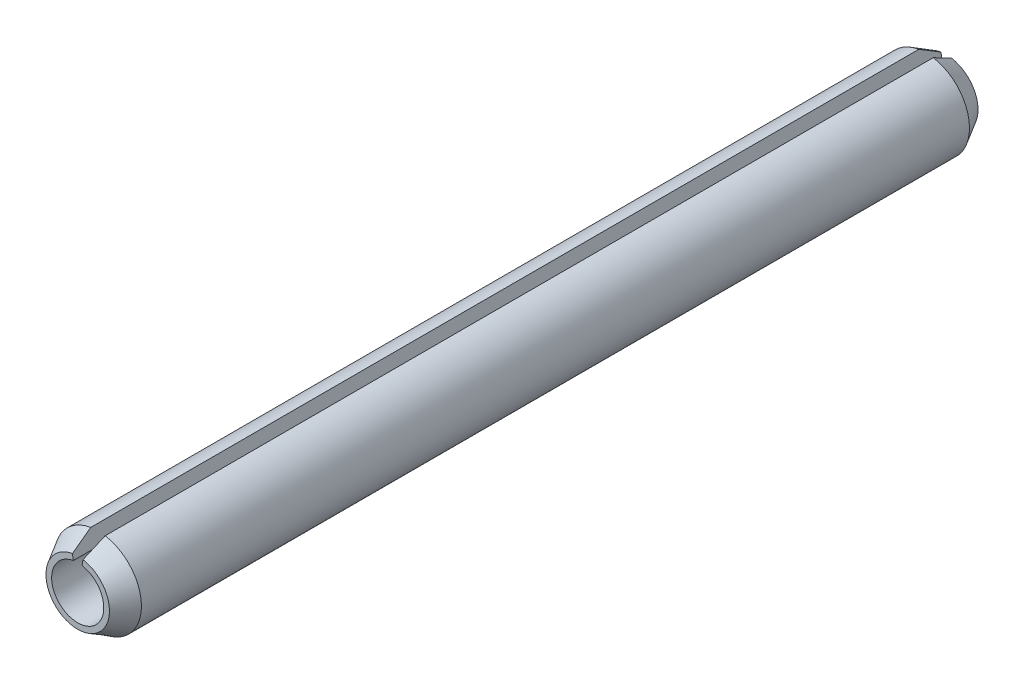
ISO-10303-21;
HEADER;
FILE_DESCRIPTION(('STEP AP214'),'2;1');
FILE_NAME('part.step','',(''),(''),'','','');
FILE_SCHEMA(('AUTOMOTIVE_DESIGN { 1 0 10303 214 1 1 1 1 }'));
ENDSEC;
DATA;
#1=APPLICATION_CONTEXT('core data for automotive mechanical design processes');
#2=APPLICATION_PROTOCOL_DEFINITION('international standard','automotive_design',2000,#1);
#3=PRODUCT_CONTEXT('',#1,'mechanical');
#4=PRODUCT('Part','Part','',(#3));
#5=PRODUCT_RELATED_PRODUCT_CATEGORY('part','',(#4));
#6=PRODUCT_DEFINITION_FORMATION('','',#4);
#7=PRODUCT_DEFINITION_CONTEXT('part definition',#1,'design');
#8=PRODUCT_DEFINITION('design','',#6,#7);
#9=PRODUCT_DEFINITION_SHAPE('','',#8);
#10=(LENGTH_UNIT() NAMED_UNIT(*) SI_UNIT(.MILLI.,.METRE.));
#11=(NAMED_UNIT(*) PLANE_ANGLE_UNIT() SI_UNIT($,.RADIAN.));
#12=(NAMED_UNIT(*) SI_UNIT($,.STERADIAN.) SOLID_ANGLE_UNIT());
#13=UNCERTAINTY_MEASURE_WITH_UNIT(LENGTH_MEASURE(1.E-05),#10,'distance_accuracy_value','');
#14=(GEOMETRIC_REPRESENTATION_CONTEXT(3) GLOBAL_UNCERTAINTY_ASSIGNED_CONTEXT((#13)) GLOBAL_UNIT_ASSIGNED_CONTEXT((#10,
#11,#12)) REPRESENTATION_CONTEXT('',''));
#15=CARTESIAN_POINT('',(0.,0.,0.));
#16=DIRECTION('',(0.,0.,1.));
#17=DIRECTION('',(1.,0.,0.));
#18=AXIS2_PLACEMENT_3D('',#15,#16,#17);
#19=CARTESIAN_POINT('',(0.,0.,30.));
#20=DIRECTION('',(0.,0.,-1.));
#21=DIRECTION('',(-1.,0.,0.));
#22=AXIS2_PLACEMENT_3D('',#19,#20,#21);
#23=CYLINDRICAL_SURFACE('',#22,3.);
#24=DIRECTION('',(0.,0.,-1.));
#25=VECTOR('',#24,1.);
#26=CARTESIAN_POINT('',(-0.5,2.95803989154981,30.));
#27=LINE('',#26,#25);
#28=CARTESIAN_POINT('',(-0.5,2.95803989154981,28.6));
#29=VERTEX_POINT('',#28);
#30=CARTESIAN_POINT('',(-0.5,2.95803989154981,-28.6));
#31=VERTEX_POINT('',#30);
#32=EDGE_CURVE('E121',#29,#31,#27,.T.);
#33=ORIENTED_EDGE('',*,*,#32,.T.);
#34=CARTESIAN_POINT('',(0.,0.,-28.6));
#35=DIRECTION('',(0.,0.,1.));
#36=DIRECTION('',(1.,0.,0.));
#37=AXIS2_PLACEMENT_3D('',#34,#35,#36);
#38=CIRCLE('',#37,3.);
#39=CARTESIAN_POINT('',(0.499999999999999,2.95803989154981,-28.6));
#40=VERTEX_POINT('',#39);
#41=EDGE_CURVE('E134',#31,#40,#38,.T.);
#42=ORIENTED_EDGE('',*,*,#41,.T.);
#43=DIRECTION('',(0.,0.,-1.));
#44=VECTOR('',#43,1.);
#45=CARTESIAN_POINT('',(0.499999999999999,2.95803989154981,30.));
#46=LINE('',#45,#44);
#47=CARTESIAN_POINT('',(0.499999999999999,2.95803989154981,28.6));
#48=VERTEX_POINT('',#47);
#49=EDGE_CURVE('E106',#48,#40,#46,.T.);
#50=ORIENTED_EDGE('',*,*,#49,.F.);
#51=CARTESIAN_POINT('',(0.,0.,28.6));
#52=DIRECTION('',(0.,0.,1.));
#53=DIRECTION('',(1.,0.,0.));
#54=AXIS2_PLACEMENT_3D('',#51,#52,#53);
#55=CIRCLE('',#54,3.);
#56=EDGE_CURVE('E132',#48,#29,#55,.F.);
#57=ORIENTED_EDGE('',*,*,#56,.T.);
#58=EDGE_LOOP('',(#33,#42,#50,#57));
#59=FACE_BOUND('',#58,.T.);
#60=ADVANCED_FACE('F41',(#59),#23,.T.);
#61=CARTESIAN_POINT('',(0.299999999999999,1.77482393492989,30.));
#62=DIRECTION('',(-0.986013297183269,0.166666666666666,0.));
#63=DIRECTION('',(-0.166666666666666,-0.98601329718327,0.));
#64=AXIS2_PLACEMENT_3D('',#61,#62,#63);
#65=PLANE('',#64);
#66=ORIENTED_EDGE('',*,*,#49,.T.);
#67=DIRECTION('',(-0.0833333333333341,-0.49300664859164,-0.866025403784435));
#68=VECTOR('',#67,1.);
#69=CARTESIAN_POINT('',(0.,0.,-33.7961524227065));
#70=LINE('',#69,#68);
#71=CARTESIAN_POINT('',(0.365284937189084,2.16105483197516,-30.));
#72=VERTEX_POINT('',#71);
#73=EDGE_CURVE('E139',#40,#72,#70,.T.);
#74=ORIENTED_EDGE('',*,*,#73,.T.);
#75=DIRECTION('',(0.166666666666666,0.986013297183269,0.));
#76=VECTOR('',#75,1.);
#77=CARTESIAN_POINT('',(0.299999999999999,1.77482393492989,-30.));
#78=LINE('',#77,#76);
#79=CARTESIAN_POINT('',(0.299999999999999,1.77482393492989,-30.));
#80=VERTEX_POINT('',#79);
#81=EDGE_CURVE('E101',#80,#72,#78,.T.);
#82=ORIENTED_EDGE('',*,*,#81,.F.);
#83=DIRECTION('',(0.,0.,-1.));
#84=VECTOR('',#83,1.);
#85=CARTESIAN_POINT('',(0.299999999999999,1.77482393492989,30.));
#86=LINE('',#85,#84);
#87=CARTESIAN_POINT('',(0.299999999999999,1.77482393492989,30.));
#88=VERTEX_POINT('',#87);
#89=EDGE_CURVE('E96',#88,#80,#86,.T.);
#90=ORIENTED_EDGE('',*,*,#89,.F.);
#91=DIRECTION('',(0.166666666666666,0.986013297183269,0.));
#92=VECTOR('',#91,1.);
#93=CARTESIAN_POINT('',(0.299999999999999,1.77482393492989,30.));
#94=LINE('',#93,#92);
#95=CARTESIAN_POINT('',(0.365284937189084,2.16105483197516,30.));
#96=VERTEX_POINT('',#95);
#97=EDGE_CURVE('E100',#88,#96,#94,.T.);
#98=ORIENTED_EDGE('',*,*,#97,.T.);
#99=DIRECTION('',(0.0833333333333341,0.49300664859164,-0.866025403784435));
#100=VECTOR('',#99,1.);
#101=CARTESIAN_POINT('',(0.,0.,33.7961524227065));
#102=LINE('',#101,#100);
#103=EDGE_CURVE('E137',#96,#48,#102,.T.);
#104=ORIENTED_EDGE('',*,*,#103,.T.);
#105=EDGE_LOOP('',(#66,#74,#82,#90,#98,#104));
#106=FACE_BOUND('',#105,.T.);
#107=ADVANCED_FACE('F99',(#106),#65,.T.);
#108=CARTESIAN_POINT('',(0.,0.,30.));
#109=DIRECTION('',(0.,0.,-1.));
#110=DIRECTION('',(-1.,0.,0.));
#111=AXIS2_PLACEMENT_3D('',#108,#109,#110);
#112=CYLINDRICAL_SURFACE('',#111,1.8);
#113=CARTESIAN_POINT('',(0.,0.,-30.));
#114=DIRECTION('',(0.,0.,1.));
#115=DIRECTION('',(1.,0.,0.));
#116=AXIS2_PLACEMENT_3D('',#113,#114,#115);
#117=CIRCLE('',#116,1.8);
#118=CARTESIAN_POINT('',(-0.3,1.77482393492989,-30.));
#119=VERTEX_POINT('',#118);
#120=EDGE_CURVE('E125',#119,#80,#117,.T.);
#121=ORIENTED_EDGE('',*,*,#120,.F.);
#122=DIRECTION('',(0.,0.,-1.));
#123=VECTOR('',#122,1.);
#124=CARTESIAN_POINT('',(-0.3,1.77482393492989,30.));
#125=LINE('',#124,#123);
#126=CARTESIAN_POINT('',(-0.3,1.77482393492989,30.));
#127=VERTEX_POINT('',#126);
#128=EDGE_CURVE('E107',#127,#119,#125,.T.);
#129=ORIENTED_EDGE('',*,*,#128,.F.);
#130=CARTESIAN_POINT('',(0.,0.,30.));
#131=DIRECTION('',(0.,0.,1.));
#132=DIRECTION('',(1.,0.,0.));
#133=AXIS2_PLACEMENT_3D('',#130,#131,#132);
#134=CIRCLE('',#133,1.8);
#135=EDGE_CURVE('E112',#127,#88,#134,.T.);
#136=ORIENTED_EDGE('',*,*,#135,.T.);
#137=ORIENTED_EDGE('',*,*,#89,.T.);
#138=EDGE_LOOP('',(#121,#129,#136,#137));
#139=FACE_BOUND('',#138,.T.);
#140=ADVANCED_FACE('F117',(#139),#112,.F.);
#141=CARTESIAN_POINT('',(-0.5,2.95803989154981,30.));
#142=DIRECTION('',(0.986013297183269,0.166666666666667,0.));
#143=DIRECTION('',(-0.166666666666667,0.986013297183269,0.));
#144=AXIS2_PLACEMENT_3D('',#141,#142,#143);
#145=PLANE('',#144);
#146=DIRECTION('',(0.166666666666667,-0.986013297183269,0.));
#147=VECTOR('',#146,1.);
#148=CARTESIAN_POINT('',(-0.5,2.95803989154981,-30.));
#149=LINE('',#148,#147);
#150=CARTESIAN_POINT('',(-0.365284937189085,2.16105483197516,-30.));
#151=VERTEX_POINT('',#150);
#152=EDGE_CURVE('E114',#151,#119,#149,.T.);
#153=ORIENTED_EDGE('',*,*,#152,.F.);
#154=DIRECTION('',(-0.0833333333333342,0.49300664859164,0.866025403784436));
#155=VECTOR('',#154,1.);
#156=CARTESIAN_POINT('',(0.,0.,-33.7961524227065));
#157=LINE('',#156,#155);
#158=EDGE_CURVE('E49',#151,#31,#157,.T.);
#159=ORIENTED_EDGE('',*,*,#158,.T.);
#160=ORIENTED_EDGE('',*,*,#32,.F.);
#161=DIRECTION('',(0.0833333333333342,-0.49300664859164,0.866025403784436));
#162=VECTOR('',#161,1.);
#163=CARTESIAN_POINT('',(0.,0.,33.7961524227065));
#164=LINE('',#163,#162);
#165=CARTESIAN_POINT('',(-0.365284937189085,2.16105483197516,30.));
#166=VERTEX_POINT('',#165);
#167=EDGE_CURVE('E56',#29,#166,#164,.T.);
#168=ORIENTED_EDGE('',*,*,#167,.T.);
#169=DIRECTION('',(0.166666666666667,-0.986013297183269,0.));
#170=VECTOR('',#169,1.);
#171=CARTESIAN_POINT('',(-0.5,2.95803989154981,30.));
#172=LINE('',#171,#170);
#173=EDGE_CURVE('E119',#166,#127,#172,.T.);
#174=ORIENTED_EDGE('',*,*,#173,.T.);
#175=ORIENTED_EDGE('',*,*,#128,.T.);
#176=EDGE_LOOP('',(#153,#159,#160,#168,#174,#175));
#177=FACE_BOUND('',#176,.T.);
#178=ADVANCED_FACE('F143',(#177),#145,.T.);
#179=CARTESIAN_POINT('',(0.,0.,30.));
#180=DIRECTION('',(0.,0.,1.));
#181=DIRECTION('',(1.,0.,0.));
#182=AXIS2_PLACEMENT_3D('',#179,#180,#181);
#183=PLANE('',#182);
#184=ORIENTED_EDGE('',*,*,#173,.F.);
#185=CARTESIAN_POINT('',(0.,0.,30.));
#186=DIRECTION('',(0.,0.,1.));
#187=DIRECTION('',(1.,0.,0.));
#188=AXIS2_PLACEMENT_3D('',#185,#186,#187);
#189=CIRCLE('',#188,2.19170962313451);
#190=EDGE_CURVE('E11',#166,#96,#189,.T.);
#191=ORIENTED_EDGE('',*,*,#190,.T.);
#192=ORIENTED_EDGE('',*,*,#97,.F.);
#193=ORIENTED_EDGE('',*,*,#135,.F.);
#194=EDGE_LOOP('',(#184,#191,#192,#193));
#195=FACE_BOUND('',#194,.T.);
#196=ADVANCED_FACE('F111',(#195),#183,.T.);
#197=CARTESIAN_POINT('',(0.,0.,-30.));
#198=DIRECTION('',(0.,0.,1.));
#199=DIRECTION('',(1.,0.,0.));
#200=AXIS2_PLACEMENT_3D('',#197,#198,#199);
#201=PLANE('',#200);
#202=ORIENTED_EDGE('',*,*,#81,.T.);
#203=CARTESIAN_POINT('',(0.,0.,-30.));
#204=DIRECTION('',(0.,0.,1.));
#205=DIRECTION('',(1.,0.,0.));
#206=AXIS2_PLACEMENT_3D('',#203,#204,#205);
#207=CIRCLE('',#206,2.19170962313451);
#208=EDGE_CURVE('E64',#72,#151,#207,.F.);
#209=ORIENTED_EDGE('',*,*,#208,.T.);
#210=ORIENTED_EDGE('',*,*,#152,.T.);
#211=ORIENTED_EDGE('',*,*,#120,.T.);
#212=EDGE_LOOP('',(#202,#209,#210,#211));
#213=FACE_BOUND('',#212,.T.);
#214=ADVANCED_FACE('F150',(#213),#201,.F.);
#215=CARTESIAN_POINT('',(0.,0.,-28.6));
#216=DIRECTION('',(0.,0.,1.));
#217=DIRECTION('',(1.,0.,0.));
#218=AXIS2_PLACEMENT_3D('',#215,#216,#217);
#219=CONICAL_SURFACE('',#218,3.,0.523598775598305);
#220=ORIENTED_EDGE('',*,*,#158,.F.);
#221=ORIENTED_EDGE('',*,*,#208,.F.);
#222=ORIENTED_EDGE('',*,*,#73,.F.);
#223=ORIENTED_EDGE('',*,*,#41,.F.);
#224=EDGE_LOOP('',(#220,#221,#222,#223));
#225=FACE_BOUND('',#224,.T.);
#226=ADVANCED_FACE('F149',(#225),#219,.T.);
#227=CARTESIAN_POINT('',(0.,0.,30.));
#228=DIRECTION('',(0.,0.,-1.));
#229=DIRECTION('',(-1.,0.,0.));
#230=AXIS2_PLACEMENT_3D('',#227,#228,#229);
#231=CONICAL_SURFACE('',#230,2.19170962313451,0.523598775598305);
#232=ORIENTED_EDGE('',*,*,#167,.F.);
#233=ORIENTED_EDGE('',*,*,#56,.F.);
#234=ORIENTED_EDGE('',*,*,#103,.F.);
#235=ORIENTED_EDGE('',*,*,#190,.F.);
#236=EDGE_LOOP('',(#232,#233,#234,#235));
#237=FACE_BOUND('',#236,.T.);
#238=ADVANCED_FACE('F43',(#237),#231,.T.);
#239=CLOSED_SHELL('',(#60,#107,#140,#178,#196,#214,#226,#238));
#240=MANIFOLD_SOLID_BREP('B2',#239);
#241=ADVANCED_BREP_SHAPE_REPRESENTATION('',(#18,#240),#14);
#242=SHAPE_DEFINITION_REPRESENTATION(#9,#241);
ENDSEC;
END-ISO-10303-21;
